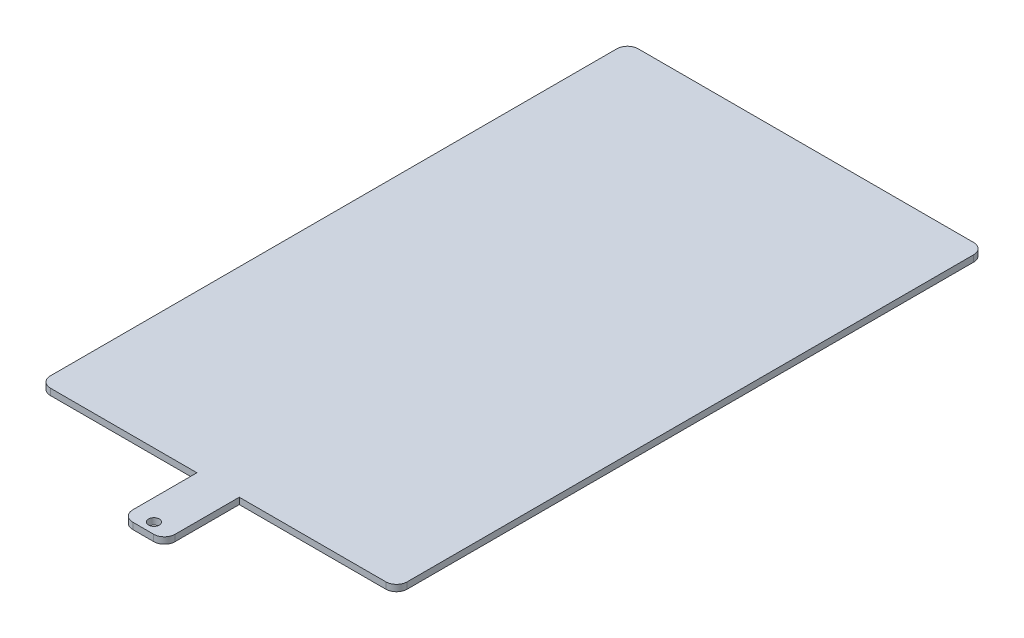
ISO-10303-21;
HEADER;
FILE_DESCRIPTION(('STEP AP214'),'2;1');
FILE_NAME('part.step','',(''),(''),'','','');
FILE_SCHEMA(('AUTOMOTIVE_DESIGN { 1 0 10303 214 1 1 1 1 }'));
ENDSEC;
DATA;
#1=APPLICATION_CONTEXT('core data for automotive mechanical design processes');
#2=APPLICATION_PROTOCOL_DEFINITION('international standard','automotive_design',2000,#1);
#3=PRODUCT_CONTEXT('',#1,'mechanical');
#4=PRODUCT('Part','Part','',(#3));
#5=PRODUCT_RELATED_PRODUCT_CATEGORY('part','',(#4));
#6=PRODUCT_DEFINITION_FORMATION('','',#4);
#7=PRODUCT_DEFINITION_CONTEXT('part definition',#1,'design');
#8=PRODUCT_DEFINITION('design','',#6,#7);
#9=PRODUCT_DEFINITION_SHAPE('','',#8);
#10=(LENGTH_UNIT() NAMED_UNIT(*) SI_UNIT(.MILLI.,.METRE.));
#11=(NAMED_UNIT(*) PLANE_ANGLE_UNIT() SI_UNIT($,.RADIAN.));
#12=(NAMED_UNIT(*) SI_UNIT($,.STERADIAN.) SOLID_ANGLE_UNIT());
#13=UNCERTAINTY_MEASURE_WITH_UNIT(LENGTH_MEASURE(1.E-05),#10,'distance_accuracy_value','');
#14=(GEOMETRIC_REPRESENTATION_CONTEXT(3) GLOBAL_UNCERTAINTY_ASSIGNED_CONTEXT((#13)) GLOBAL_UNIT_ASSIGNED_CONTEXT((#10,
#11,#12)) REPRESENTATION_CONTEXT('',''));
#15=CARTESIAN_POINT('',(0.,0.,0.));
#16=DIRECTION('',(0.,0.,1.));
#17=DIRECTION('',(1.,0.,0.));
#18=AXIS2_PLACEMENT_3D('',#15,#16,#17);
#19=CARTESIAN_POINT('',(0.,3.,0.));
#20=DIRECTION('',(1.,0.,0.));
#21=DIRECTION('',(0.,0.,-1.));
#22=AXIS2_PLACEMENT_3D('',#19,#20,#21);
#23=PLANE('',#22);
#24=DIRECTION('',(0.,0.,1.));
#25=VECTOR('',#24,1.);
#26=CARTESIAN_POINT('',(0.,0.,0.));
#27=LINE('',#26,#25);
#28=CARTESIAN_POINT('',(0.,0.,-269.8));
#29=VERTEX_POINT('',#28);
#30=CARTESIAN_POINT('',(0.,0.,-5.));
#31=VERTEX_POINT('',#30);
#32=EDGE_CURVE('E177',#29,#31,#27,.T.);
#33=ORIENTED_EDGE('',*,*,#32,.T.);
#34=DIRECTION('',(0.,-1.,0.));
#35=VECTOR('',#34,1.);
#36=CARTESIAN_POINT('',(0.,3.,-5.));
#37=LINE('',#36,#35);
#38=CARTESIAN_POINT('',(0.,3.,-5.));
#39=VERTEX_POINT('',#38);
#40=EDGE_CURVE('E237',#31,#39,#37,.F.);
#41=ORIENTED_EDGE('',*,*,#40,.T.);
#42=DIRECTION('',(0.,0.,1.));
#43=VECTOR('',#42,1.);
#44=CARTESIAN_POINT('',(0.,3.,0.));
#45=LINE('',#44,#43);
#46=CARTESIAN_POINT('',(0.,3.,-269.8));
#47=VERTEX_POINT('',#46);
#48=EDGE_CURVE('E147',#47,#39,#45,.T.);
#49=ORIENTED_EDGE('',*,*,#48,.F.);
#50=DIRECTION('',(0.,-1.,0.));
#51=VECTOR('',#50,1.);
#52=CARTESIAN_POINT('',(0.,3.,-269.8));
#53=LINE('',#52,#51);
#54=EDGE_CURVE('E234',#47,#29,#53,.T.);
#55=ORIENTED_EDGE('',*,*,#54,.T.);
#56=EDGE_LOOP('',(#33,#41,#49,#55));
#57=FACE_BOUND('',#56,.T.);
#58=ADVANCED_FACE('F33',(#57),#23,.F.);
#59=CARTESIAN_POINT('',(0.,3.,0.));
#60=DIRECTION('',(0.,0.,-1.));
#61=DIRECTION('',(-1.,0.,0.));
#62=AXIS2_PLACEMENT_3D('',#59,#60,#61);
#63=PLANE('',#62);
#64=DIRECTION('',(1.,0.,0.));
#65=VECTOR('',#64,1.);
#66=CARTESIAN_POINT('',(0.,3.,0.));
#67=LINE('',#66,#65);
#68=CARTESIAN_POINT('',(5.,3.,0.));
#69=VERTEX_POINT('',#68);
#70=CARTESIAN_POINT('',(73.5,3.,0.));
#71=VERTEX_POINT('',#70);
#72=EDGE_CURVE('E134',#69,#71,#67,.T.);
#73=ORIENTED_EDGE('',*,*,#72,.F.);
#74=DIRECTION('',(0.,-1.,0.));
#75=VECTOR('',#74,1.);
#76=CARTESIAN_POINT('',(5.,3.,0.));
#77=LINE('',#76,#75);
#78=CARTESIAN_POINT('',(5.,0.,0.));
#79=VERTEX_POINT('',#78);
#80=EDGE_CURVE('E232',#69,#79,#77,.T.);
#81=ORIENTED_EDGE('',*,*,#80,.T.);
#82=DIRECTION('',(1.,0.,0.));
#83=VECTOR('',#82,1.);
#84=CARTESIAN_POINT('',(0.,0.,0.));
#85=LINE('',#84,#83);
#86=CARTESIAN_POINT('',(73.5,0.,0.));
#87=VERTEX_POINT('',#86);
#88=EDGE_CURVE('E153',#79,#87,#85,.T.);
#89=ORIENTED_EDGE('',*,*,#88,.T.);
#90=DIRECTION('',(0.,-1.,0.));
#91=VECTOR('',#90,1.);
#92=CARTESIAN_POINT('',(73.5,3.,0.));
#93=LINE('',#92,#91);
#94=EDGE_CURVE('E150',#71,#87,#93,.T.);
#95=ORIENTED_EDGE('',*,*,#94,.F.);
#96=EDGE_LOOP('',(#73,#81,#89,#95));
#97=FACE_BOUND('',#96,.T.);
#98=ADVANCED_FACE('F151',(#97),#63,.F.);
#99=CARTESIAN_POINT('',(73.5,3.,0.));
#100=DIRECTION('',(1.,0.,0.));
#101=DIRECTION('',(0.,0.,-1.));
#102=AXIS2_PLACEMENT_3D('',#99,#100,#101);
#103=PLANE('',#102);
#104=DIRECTION('',(0.,0.,1.));
#105=VECTOR('',#104,1.);
#106=CARTESIAN_POINT('',(73.5,0.,0.));
#107=LINE('',#106,#105);
#108=CARTESIAN_POINT('',(73.5,0.,30.));
#109=VERTEX_POINT('',#108);
#110=EDGE_CURVE('E182',#87,#109,#107,.T.);
#111=ORIENTED_EDGE('',*,*,#110,.T.);
#112=DIRECTION('',(0.,-1.,0.));
#113=VECTOR('',#112,1.);
#114=CARTESIAN_POINT('',(73.5,3.,30.));
#115=LINE('',#114,#113);
#116=CARTESIAN_POINT('',(73.5,3.,30.));
#117=VERTEX_POINT('',#116);
#118=EDGE_CURVE('E162',#109,#117,#115,.F.);
#119=ORIENTED_EDGE('',*,*,#118,.T.);
#120=DIRECTION('',(0.,0.,1.));
#121=VECTOR('',#120,1.);
#122=CARTESIAN_POINT('',(73.5,3.,0.));
#123=LINE('',#122,#121);
#124=EDGE_CURVE('E139',#71,#117,#123,.T.);
#125=ORIENTED_EDGE('',*,*,#124,.F.);
#126=ORIENTED_EDGE('',*,*,#94,.T.);
#127=EDGE_LOOP('',(#111,#119,#125,#126));
#128=FACE_BOUND('',#127,.T.);
#129=ADVANCED_FACE('F160',(#128),#103,.F.);
#130=CARTESIAN_POINT('',(73.5,3.,35.));
#131=DIRECTION('',(0.,0.,-1.));
#132=DIRECTION('',(-1.,0.,0.));
#133=AXIS2_PLACEMENT_3D('',#130,#131,#132);
#134=PLANE('',#133);
#135=DIRECTION('',(1.,0.,0.));
#136=VECTOR('',#135,1.);
#137=CARTESIAN_POINT('',(73.5,0.,35.));
#138=LINE('',#137,#136);
#139=CARTESIAN_POINT('',(78.5,0.,35.));
#140=VERTEX_POINT('',#139);
#141=CARTESIAN_POINT('',(88.3,0.,35.));
#142=VERTEX_POINT('',#141);
#143=EDGE_CURVE('E184',#140,#142,#138,.T.);
#144=ORIENTED_EDGE('',*,*,#143,.T.);
#145=DIRECTION('',(0.,-1.,0.));
#146=VECTOR('',#145,1.);
#147=CARTESIAN_POINT('',(88.3,3.,35.));
#148=LINE('',#147,#146);
#149=CARTESIAN_POINT('',(88.3,3.,35.));
#150=VERTEX_POINT('',#149);
#151=EDGE_CURVE('E219',#142,#150,#148,.F.);
#152=ORIENTED_EDGE('',*,*,#151,.T.);
#153=DIRECTION('',(1.,0.,0.));
#154=VECTOR('',#153,1.);
#155=CARTESIAN_POINT('',(73.5,3.,35.));
#156=LINE('',#155,#154);
#157=CARTESIAN_POINT('',(78.5,3.,35.));
#158=VERTEX_POINT('',#157);
#159=EDGE_CURVE('E163',#158,#150,#156,.T.);
#160=ORIENTED_EDGE('',*,*,#159,.F.);
#161=DIRECTION('',(0.,-1.,0.));
#162=VECTOR('',#161,1.);
#163=CARTESIAN_POINT('',(78.5,3.,35.));
#164=LINE('',#163,#162);
#165=EDGE_CURVE('E216',#158,#140,#164,.T.);
#166=ORIENTED_EDGE('',*,*,#165,.T.);
#167=EDGE_LOOP('',(#144,#152,#160,#166));
#168=FACE_BOUND('',#167,.T.);
#169=ADVANCED_FACE('F391',(#168),#134,.F.);
#170=CARTESIAN_POINT('',(93.3,3.,35.));
#171=DIRECTION('',(-1.,0.,0.));
#172=DIRECTION('',(0.,0.,1.));
#173=AXIS2_PLACEMENT_3D('',#170,#171,#172);
#174=PLANE('',#173);
#175=DIRECTION('',(0.,0.,-1.));
#176=VECTOR('',#175,1.);
#177=CARTESIAN_POINT('',(93.3,3.,35.));
#178=LINE('',#177,#176);
#179=CARTESIAN_POINT('',(93.3,3.,30.));
#180=VERTEX_POINT('',#179);
#181=CARTESIAN_POINT('',(93.3,3.,0.));
#182=VERTEX_POINT('',#181);
#183=EDGE_CURVE('E165',#180,#182,#178,.T.);
#184=ORIENTED_EDGE('',*,*,#183,.F.);
#185=DIRECTION('',(0.,-1.,0.));
#186=VECTOR('',#185,1.);
#187=CARTESIAN_POINT('',(93.3,3.,30.));
#188=LINE('',#187,#186);
#189=CARTESIAN_POINT('',(93.3,0.,30.));
#190=VERTEX_POINT('',#189);
#191=EDGE_CURVE('E157',#180,#190,#188,.T.);
#192=ORIENTED_EDGE('',*,*,#191,.T.);
#193=DIRECTION('',(0.,0.,-1.));
#194=VECTOR('',#193,1.);
#195=CARTESIAN_POINT('',(93.3,0.,35.));
#196=LINE('',#195,#194);
#197=CARTESIAN_POINT('',(93.3,0.,0.));
#198=VERTEX_POINT('',#197);
#199=EDGE_CURVE('E187',#190,#198,#196,.T.);
#200=ORIENTED_EDGE('',*,*,#199,.T.);
#201=DIRECTION('',(0.,-1.,0.));
#202=VECTOR('',#201,1.);
#203=CARTESIAN_POINT('',(93.3,3.,0.));
#204=LINE('',#203,#202);
#205=EDGE_CURVE('E158',#182,#198,#204,.T.);
#206=ORIENTED_EDGE('',*,*,#205,.F.);
#207=EDGE_LOOP('',(#184,#192,#200,#206));
#208=FACE_BOUND('',#207,.T.);
#209=ADVANCED_FACE('F382',(#208),#174,.F.);
#210=CARTESIAN_POINT('',(93.3,3.,0.));
#211=DIRECTION('',(0.,0.,-1.));
#212=DIRECTION('',(-1.,0.,0.));
#213=AXIS2_PLACEMENT_3D('',#210,#211,#212);
#214=PLANE('',#213);
#215=DIRECTION('',(1.,0.,0.));
#216=VECTOR('',#215,1.);
#217=CARTESIAN_POINT('',(93.3,0.,0.));
#218=LINE('',#217,#216);
#219=CARTESIAN_POINT('',(161.8,0.,0.));
#220=VERTEX_POINT('',#219);
#221=EDGE_CURVE('E189',#198,#220,#218,.T.);
#222=ORIENTED_EDGE('',*,*,#221,.T.);
#223=DIRECTION('',(0.,-1.,0.));
#224=VECTOR('',#223,1.);
#225=CARTESIAN_POINT('',(161.8,3.,0.));
#226=LINE('',#225,#224);
#227=CARTESIAN_POINT('',(161.8,3.,0.));
#228=VERTEX_POINT('',#227);
#229=EDGE_CURVE('E244',#220,#228,#226,.F.);
#230=ORIENTED_EDGE('',*,*,#229,.T.);
#231=DIRECTION('',(1.,0.,0.));
#232=VECTOR('',#231,1.);
#233=CARTESIAN_POINT('',(93.3,3.,0.));
#234=LINE('',#233,#232);
#235=EDGE_CURVE('E170',#182,#228,#234,.T.);
#236=ORIENTED_EDGE('',*,*,#235,.F.);
#237=ORIENTED_EDGE('',*,*,#205,.T.);
#238=EDGE_LOOP('',(#222,#230,#236,#237));
#239=FACE_BOUND('',#238,.T.);
#240=ADVANCED_FACE('F248',(#239),#214,.F.);
#241=CARTESIAN_POINT('',(166.8,3.,0.));
#242=DIRECTION('',(-1.,0.,0.));
#243=DIRECTION('',(0.,0.,1.));
#244=AXIS2_PLACEMENT_3D('',#241,#242,#243);
#245=PLANE('',#244);
#246=DIRECTION('',(0.,0.,-1.));
#247=VECTOR('',#246,1.);
#248=CARTESIAN_POINT('',(166.8,3.,0.));
#249=LINE('',#248,#247);
#250=CARTESIAN_POINT('',(166.8,3.,-5.));
#251=VERTEX_POINT('',#250);
#252=CARTESIAN_POINT('',(166.8,3.,-269.8));
#253=VERTEX_POINT('',#252);
#254=EDGE_CURVE('E173',#251,#253,#249,.T.);
#255=ORIENTED_EDGE('',*,*,#254,.F.);
#256=DIRECTION('',(0.,-1.,0.));
#257=VECTOR('',#256,1.);
#258=CARTESIAN_POINT('',(166.8,3.,-5.));
#259=LINE('',#258,#257);
#260=CARTESIAN_POINT('',(166.8,0.,-5.));
#261=VERTEX_POINT('',#260);
#262=EDGE_CURVE('E241',#251,#261,#259,.T.);
#263=ORIENTED_EDGE('',*,*,#262,.T.);
#264=DIRECTION('',(0.,0.,-1.));
#265=VECTOR('',#264,1.);
#266=CARTESIAN_POINT('',(166.8,0.,0.));
#267=LINE('',#266,#265);
#268=CARTESIAN_POINT('',(166.8,0.,-269.8));
#269=VERTEX_POINT('',#268);
#270=EDGE_CURVE('E192',#261,#269,#267,.T.);
#271=ORIENTED_EDGE('',*,*,#270,.T.);
#272=DIRECTION('',(0.,-1.,0.));
#273=VECTOR('',#272,1.);
#274=CARTESIAN_POINT('',(166.8,3.,-269.8));
#275=LINE('',#274,#273);
#276=EDGE_CURVE('E239',#269,#253,#275,.F.);
#277=ORIENTED_EDGE('',*,*,#276,.T.);
#278=EDGE_LOOP('',(#255,#263,#271,#277));
#279=FACE_BOUND('',#278,.T.);
#280=ADVANCED_FACE('F259',(#279),#245,.F.);
#281=CARTESIAN_POINT('',(0.,3.,-274.8));
#282=DIRECTION('',(0.,0.,1.));
#283=DIRECTION('',(1.,0.,0.));
#284=AXIS2_PLACEMENT_3D('',#281,#282,#283);
#285=PLANE('',#284);
#286=DIRECTION('',(-1.,0.,0.));
#287=VECTOR('',#286,1.);
#288=CARTESIAN_POINT('',(0.,3.,-274.8));
#289=LINE('',#288,#287);
#290=CARTESIAN_POINT('',(161.8,3.,-274.8));
#291=VERTEX_POINT('',#290);
#292=CARTESIAN_POINT('',(5.,3.,-274.8));
#293=VERTEX_POINT('',#292);
#294=EDGE_CURVE('E175',#291,#293,#289,.T.);
#295=ORIENTED_EDGE('',*,*,#294,.F.);
#296=DIRECTION('',(0.,-1.,0.));
#297=VECTOR('',#296,1.);
#298=CARTESIAN_POINT('',(161.8,3.,-274.8));
#299=LINE('',#298,#297);
#300=CARTESIAN_POINT('',(161.8,0.,-274.8));
#301=VERTEX_POINT('',#300);
#302=EDGE_CURVE('E11',#291,#301,#299,.T.);
#303=ORIENTED_EDGE('',*,*,#302,.T.);
#304=DIRECTION('',(-1.,0.,0.));
#305=VECTOR('',#304,1.);
#306=CARTESIAN_POINT('',(0.,0.,-274.8));
#307=LINE('',#306,#305);
#308=CARTESIAN_POINT('',(5.,0.,-274.8));
#309=VERTEX_POINT('',#308);
#310=EDGE_CURVE('E195',#301,#309,#307,.T.);
#311=ORIENTED_EDGE('',*,*,#310,.T.);
#312=DIRECTION('',(0.,-1.,0.));
#313=VECTOR('',#312,1.);
#314=CARTESIAN_POINT('',(5.,3.,-274.8));
#315=LINE('',#314,#313);
#316=EDGE_CURVE('E41',#309,#293,#315,.F.);
#317=ORIENTED_EDGE('',*,*,#316,.T.);
#318=EDGE_LOOP('',(#295,#303,#311,#317));
#319=FACE_BOUND('',#318,.T.);
#320=ADVANCED_FACE('F268',(#319),#285,.F.);
#321=CARTESIAN_POINT('',(0.,3.,0.));
#322=DIRECTION('',(0.,-1.,0.));
#323=DIRECTION('',(0.,0.,-1.));
#324=AXIS2_PLACEMENT_3D('',#321,#322,#323);
#325=PLANE('',#324);
#326=CARTESIAN_POINT('',(83.4,3.,30.));
#327=DIRECTION('',(0.,1.,0.));
#328=DIRECTION('',(0.,0.,1.));
#329=AXIS2_PLACEMENT_3D('',#326,#327,#328);
#330=CIRCLE('',#329,2.5);
#331=CARTESIAN_POINT('',(83.4,3.,32.5));
#332=VERTEX_POINT('',#331);
#333=EDGE_CURVE('E201',#332,#332,#330,.T.);
#334=ORIENTED_EDGE('',*,*,#333,.F.);
#335=EDGE_LOOP('',(#334));
#336=FACE_BOUND('',#335,.T.);
#337=ORIENTED_EDGE('',*,*,#159,.T.);
#338=CARTESIAN_POINT('',(88.3,3.,30.));
#339=DIRECTION('',(0.,-1.,0.));
#340=DIRECTION('',(0.,0.,-1.));
#341=AXIS2_PLACEMENT_3D('',#338,#339,#340);
#342=CIRCLE('',#341,5.);
#343=EDGE_CURVE('E229',#150,#180,#342,.F.);
#344=ORIENTED_EDGE('',*,*,#343,.T.);
#345=ORIENTED_EDGE('',*,*,#183,.T.);
#346=ORIENTED_EDGE('',*,*,#235,.T.);
#347=CARTESIAN_POINT('',(161.8,3.,-5.));
#348=DIRECTION('',(0.,-1.,0.));
#349=DIRECTION('',(0.,0.,-1.));
#350=AXIS2_PLACEMENT_3D('',#347,#348,#349);
#351=CIRCLE('',#350,5.);
#352=EDGE_CURVE('E224',#228,#251,#351,.F.);
#353=ORIENTED_EDGE('',*,*,#352,.T.);
#354=ORIENTED_EDGE('',*,*,#254,.T.);
#355=CARTESIAN_POINT('',(161.8,3.,-269.8));
#356=DIRECTION('',(0.,-1.,0.));
#357=DIRECTION('',(0.,0.,-1.));
#358=AXIS2_PLACEMENT_3D('',#355,#356,#357);
#359=CIRCLE('',#358,5.);
#360=EDGE_CURVE('E54',#253,#291,#359,.F.);
#361=ORIENTED_EDGE('',*,*,#360,.T.);
#362=ORIENTED_EDGE('',*,*,#294,.T.);
#363=CARTESIAN_POINT('',(5.,3.,-269.8));
#364=DIRECTION('',(0.,-1.,0.));
#365=DIRECTION('',(0.,0.,-1.));
#366=AXIS2_PLACEMENT_3D('',#363,#364,#365);
#367=CIRCLE('',#366,5.);
#368=EDGE_CURVE('E221',#293,#47,#367,.F.);
#369=ORIENTED_EDGE('',*,*,#368,.T.);
#370=ORIENTED_EDGE('',*,*,#48,.T.);
#371=CARTESIAN_POINT('',(5.,3.,-5.));
#372=DIRECTION('',(0.,-1.,0.));
#373=DIRECTION('',(0.,0.,-1.));
#374=AXIS2_PLACEMENT_3D('',#371,#372,#373);
#375=CIRCLE('',#374,5.);
#376=EDGE_CURVE('E143',#39,#69,#375,.F.);
#377=ORIENTED_EDGE('',*,*,#376,.T.);
#378=ORIENTED_EDGE('',*,*,#72,.T.);
#379=ORIENTED_EDGE('',*,*,#124,.T.);
#380=CARTESIAN_POINT('',(78.5,3.,30.));
#381=DIRECTION('',(0.,-1.,0.));
#382=DIRECTION('',(0.,0.,-1.));
#383=AXIS2_PLACEMENT_3D('',#380,#381,#382);
#384=CIRCLE('',#383,5.);
#385=EDGE_CURVE('E227',#117,#158,#384,.F.);
#386=ORIENTED_EDGE('',*,*,#385,.T.);
#387=EDGE_LOOP('',(#337,#344,#345,#346,#353,#354,#361,#362,#369,#370,#377,#378,#379,#386));
#388=FACE_BOUND('',#387,.T.);
#389=ADVANCED_FACE('F137',(#336,#388),#325,.F.);
#390=CARTESIAN_POINT('',(0.,0.,0.));
#391=DIRECTION('',(0.,-1.,0.));
#392=DIRECTION('',(0.,0.,-1.));
#393=AXIS2_PLACEMENT_3D('',#390,#391,#392);
#394=PLANE('',#393);
#395=CARTESIAN_POINT('',(83.4,0.,30.));
#396=DIRECTION('',(0.,-1.,0.));
#397=DIRECTION('',(0.,0.,-1.));
#398=AXIS2_PLACEMENT_3D('',#395,#396,#397);
#399=CIRCLE('',#398,2.5);
#400=CARTESIAN_POINT('',(83.4,0.,27.5));
#401=VERTEX_POINT('',#400);
#402=EDGE_CURVE('E180',#401,#401,#399,.T.);
#403=ORIENTED_EDGE('',*,*,#402,.F.);
#404=EDGE_LOOP('',(#403));
#405=FACE_BOUND('',#404,.T.);
#406=ORIENTED_EDGE('',*,*,#199,.F.);
#407=CARTESIAN_POINT('',(88.3,0.,30.));
#408=DIRECTION('',(0.,-1.,0.));
#409=DIRECTION('',(0.,0.,-1.));
#410=AXIS2_PLACEMENT_3D('',#407,#408,#409);
#411=CIRCLE('',#410,5.);
#412=EDGE_CURVE('E214',#190,#142,#411,.T.);
#413=ORIENTED_EDGE('',*,*,#412,.T.);
#414=ORIENTED_EDGE('',*,*,#143,.F.);
#415=CARTESIAN_POINT('',(78.5,0.,30.));
#416=DIRECTION('',(0.,-1.,0.));
#417=DIRECTION('',(0.,0.,-1.));
#418=AXIS2_PLACEMENT_3D('',#415,#416,#417);
#419=CIRCLE('',#418,5.);
#420=EDGE_CURVE('E212',#140,#109,#419,.T.);
#421=ORIENTED_EDGE('',*,*,#420,.T.);
#422=ORIENTED_EDGE('',*,*,#110,.F.);
#423=ORIENTED_EDGE('',*,*,#88,.F.);
#424=CARTESIAN_POINT('',(5.,0.,-5.));
#425=DIRECTION('',(0.,-1.,0.));
#426=DIRECTION('',(0.,0.,-1.));
#427=AXIS2_PLACEMENT_3D('',#424,#425,#426);
#428=CIRCLE('',#427,5.);
#429=EDGE_CURVE('E210',#79,#31,#428,.T.);
#430=ORIENTED_EDGE('',*,*,#429,.T.);
#431=ORIENTED_EDGE('',*,*,#32,.F.);
#432=CARTESIAN_POINT('',(5.,0.,-269.8));
#433=DIRECTION('',(0.,-1.,0.));
#434=DIRECTION('',(0.,0.,-1.));
#435=AXIS2_PLACEMENT_3D('',#432,#433,#434);
#436=CIRCLE('',#435,5.);
#437=EDGE_CURVE('E204',#29,#309,#436,.T.);
#438=ORIENTED_EDGE('',*,*,#437,.T.);
#439=ORIENTED_EDGE('',*,*,#310,.F.);
#440=CARTESIAN_POINT('',(161.8,0.,-269.8));
#441=DIRECTION('',(0.,-1.,0.));
#442=DIRECTION('',(0.,0.,-1.));
#443=AXIS2_PLACEMENT_3D('',#440,#441,#442);
#444=CIRCLE('',#443,5.);
#445=EDGE_CURVE('E206',#301,#269,#444,.T.);
#446=ORIENTED_EDGE('',*,*,#445,.T.);
#447=ORIENTED_EDGE('',*,*,#270,.F.);
#448=CARTESIAN_POINT('',(161.8,0.,-5.));
#449=DIRECTION('',(0.,-1.,0.));
#450=DIRECTION('',(0.,0.,-1.));
#451=AXIS2_PLACEMENT_3D('',#448,#449,#450);
#452=CIRCLE('',#451,5.);
#453=EDGE_CURVE('E208',#261,#220,#452,.T.);
#454=ORIENTED_EDGE('',*,*,#453,.T.);
#455=ORIENTED_EDGE('',*,*,#221,.F.);
#456=EDGE_LOOP('',(#406,#413,#414,#421,#422,#423,#430,#431,#438,#439,#446,#447,#454,#455));
#457=FACE_BOUND('',#456,.T.);
#458=ADVANCED_FACE('F263',(#405,#457),#394,.T.);
#459=CARTESIAN_POINT('',(83.4,-2.,30.));
#460=DIRECTION('',(0.,1.,0.));
#461=DIRECTION('',(0.,0.,1.));
#462=AXIS2_PLACEMENT_3D('',#459,#460,#461);
#463=CYLINDRICAL_SURFACE('',#462,2.5);
#464=ORIENTED_EDGE('',*,*,#402,.T.);
#465=EDGE_LOOP('',(#464));
#466=FACE_BOUND('',#465,.T.);
#467=ORIENTED_EDGE('',*,*,#333,.T.);
#468=EDGE_LOOP('',(#467));
#469=FACE_BOUND('',#468,.T.);
#470=ADVANCED_FACE('F282',(#466,#469),#463,.F.);
#471=CARTESIAN_POINT('',(88.3,3.,30.));
#472=DIRECTION('',(0.,-1.,0.));
#473=DIRECTION('',(0.,0.,-1.));
#474=AXIS2_PLACEMENT_3D('',#471,#472,#473);
#475=CYLINDRICAL_SURFACE('',#474,5.);
#476=ORIENTED_EDGE('',*,*,#343,.F.);
#477=ORIENTED_EDGE('',*,*,#151,.F.);
#478=ORIENTED_EDGE('',*,*,#412,.F.);
#479=ORIENTED_EDGE('',*,*,#191,.F.);
#480=EDGE_LOOP('',(#476,#477,#478,#479));
#481=FACE_BOUND('',#480,.T.);
#482=ADVANCED_FACE('F302',(#481),#475,.T.);
#483=CARTESIAN_POINT('',(78.5,3.,30.));
#484=DIRECTION('',(0.,-1.,0.));
#485=DIRECTION('',(0.,0.,-1.));
#486=AXIS2_PLACEMENT_3D('',#483,#484,#485);
#487=CYLINDRICAL_SURFACE('',#486,5.);
#488=ORIENTED_EDGE('',*,*,#385,.F.);
#489=ORIENTED_EDGE('',*,*,#118,.F.);
#490=ORIENTED_EDGE('',*,*,#420,.F.);
#491=ORIENTED_EDGE('',*,*,#165,.F.);
#492=EDGE_LOOP('',(#488,#489,#490,#491));
#493=FACE_BOUND('',#492,.T.);
#494=ADVANCED_FACE('F305',(#493),#487,.T.);
#495=CARTESIAN_POINT('',(5.,3.,-5.));
#496=DIRECTION('',(0.,-1.,0.));
#497=DIRECTION('',(0.,0.,-1.));
#498=AXIS2_PLACEMENT_3D('',#495,#496,#497);
#499=CYLINDRICAL_SURFACE('',#498,5.);
#500=ORIENTED_EDGE('',*,*,#376,.F.);
#501=ORIENTED_EDGE('',*,*,#40,.F.);
#502=ORIENTED_EDGE('',*,*,#429,.F.);
#503=ORIENTED_EDGE('',*,*,#80,.F.);
#504=EDGE_LOOP('',(#500,#501,#502,#503));
#505=FACE_BOUND('',#504,.T.);
#506=ADVANCED_FACE('F277',(#505),#499,.T.);
#507=CARTESIAN_POINT('',(161.8,3.,-5.));
#508=DIRECTION('',(0.,-1.,0.));
#509=DIRECTION('',(0.,0.,-1.));
#510=AXIS2_PLACEMENT_3D('',#507,#508,#509);
#511=CYLINDRICAL_SURFACE('',#510,5.);
#512=ORIENTED_EDGE('',*,*,#352,.F.);
#513=ORIENTED_EDGE('',*,*,#229,.F.);
#514=ORIENTED_EDGE('',*,*,#453,.F.);
#515=ORIENTED_EDGE('',*,*,#262,.F.);
#516=EDGE_LOOP('',(#512,#513,#514,#515));
#517=FACE_BOUND('',#516,.T.);
#518=ADVANCED_FACE('F256',(#517),#511,.T.);
#519=CARTESIAN_POINT('',(161.8,3.,-269.8));
#520=DIRECTION('',(0.,-1.,0.));
#521=DIRECTION('',(0.,0.,-1.));
#522=AXIS2_PLACEMENT_3D('',#519,#520,#521);
#523=CYLINDRICAL_SURFACE('',#522,5.);
#524=ORIENTED_EDGE('',*,*,#360,.F.);
#525=ORIENTED_EDGE('',*,*,#276,.F.);
#526=ORIENTED_EDGE('',*,*,#445,.F.);
#527=ORIENTED_EDGE('',*,*,#302,.F.);
#528=EDGE_LOOP('',(#524,#525,#526,#527));
#529=FACE_BOUND('',#528,.T.);
#530=ADVANCED_FACE('F267',(#529),#523,.T.);
#531=CARTESIAN_POINT('',(5.,3.,-269.8));
#532=DIRECTION('',(0.,-1.,0.));
#533=DIRECTION('',(0.,0.,-1.));
#534=AXIS2_PLACEMENT_3D('',#531,#532,#533);
#535=CYLINDRICAL_SURFACE('',#534,5.);
#536=ORIENTED_EDGE('',*,*,#368,.F.);
#537=ORIENTED_EDGE('',*,*,#316,.F.);
#538=ORIENTED_EDGE('',*,*,#437,.F.);
#539=ORIENTED_EDGE('',*,*,#54,.F.);
#540=EDGE_LOOP('',(#536,#537,#538,#539));
#541=FACE_BOUND('',#540,.T.);
#542=ADVANCED_FACE('F35',(#541),#535,.T.);
#543=CLOSED_SHELL('',(#58,#98,#129,#169,#209,#240,#280,#320,#389,#458,#470,#482,#494,#506,#518,
#530,#542));
#544=MANIFOLD_SOLID_BREP('B2',#543);
#545=ADVANCED_BREP_SHAPE_REPRESENTATION('',(#18,#544),#14);
#546=SHAPE_DEFINITION_REPRESENTATION(#9,#545);
ENDSEC;
END-ISO-10303-21;
